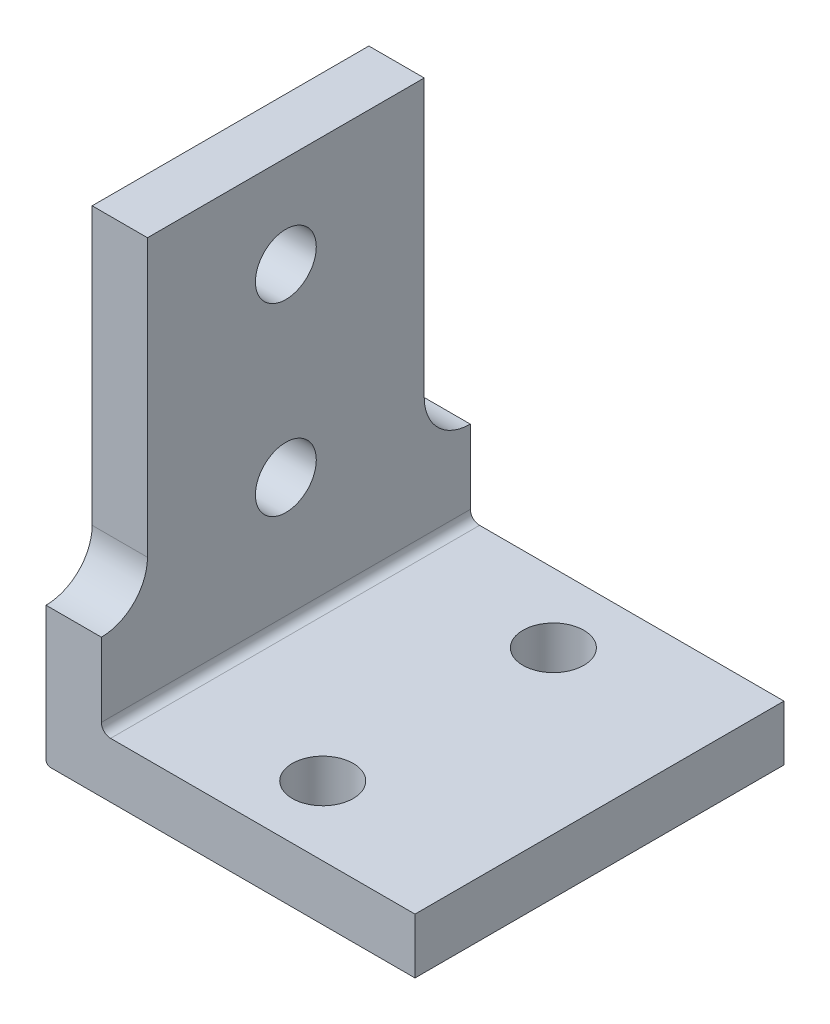
ISO-10303-21;
HEADER;
FILE_DESCRIPTION(('STEP AP214'),'2;1');
FILE_NAME('part.step','',(''),(''),'','','');
FILE_SCHEMA(('AUTOMOTIVE_DESIGN { 1 0 10303 214 1 1 1 1 }'));
ENDSEC;
DATA;
#1=APPLICATION_CONTEXT('core data for automotive mechanical design processes');
#2=APPLICATION_PROTOCOL_DEFINITION('international standard','automotive_design',2000,#1);
#3=PRODUCT_CONTEXT('',#1,'mechanical');
#4=PRODUCT('Part','Part','',(#3));
#5=PRODUCT_RELATED_PRODUCT_CATEGORY('part','',(#4));
#6=PRODUCT_DEFINITION_FORMATION('','',#4);
#7=PRODUCT_DEFINITION_CONTEXT('part definition',#1,'design');
#8=PRODUCT_DEFINITION('design','',#6,#7);
#9=PRODUCT_DEFINITION_SHAPE('','',#8);
#10=(LENGTH_UNIT() NAMED_UNIT(*) SI_UNIT(.MILLI.,.METRE.));
#11=(NAMED_UNIT(*) PLANE_ANGLE_UNIT() SI_UNIT($,.RADIAN.));
#12=(NAMED_UNIT(*) SI_UNIT($,.STERADIAN.) SOLID_ANGLE_UNIT());
#13=UNCERTAINTY_MEASURE_WITH_UNIT(LENGTH_MEASURE(1.E-05),#10,'distance_accuracy_value','');
#14=(GEOMETRIC_REPRESENTATION_CONTEXT(3) GLOBAL_UNCERTAINTY_ASSIGNED_CONTEXT((#13)) GLOBAL_UNIT_ASSIGNED_CONTEXT((#10,
#11,#12)) REPRESENTATION_CONTEXT('',''));
#15=CARTESIAN_POINT('',(0.,0.,0.));
#16=DIRECTION('',(0.,0.,1.));
#17=DIRECTION('',(1.,0.,0.));
#18=AXIS2_PLACEMENT_3D('',#15,#16,#17);
#19=CARTESIAN_POINT('',(0.,50.,40.));
#20=DIRECTION('',(1.,0.,0.));
#21=DIRECTION('',(0.,0.,-1.));
#22=AXIS2_PLACEMENT_3D('',#19,#20,#21);
#23=PLANE('',#22);
#24=CARTESIAN_POINT('',(0.,40.,20.));
#25=DIRECTION('',(1.,0.,0.));
#26=DIRECTION('',(0.,0.,-1.));
#27=AXIS2_PLACEMENT_3D('',#24,#25,#26);
#28=CIRCLE('',#27,3.3);
#29=CARTESIAN_POINT('',(0.,40.,16.7));
#30=VERTEX_POINT('',#29);
#31=EDGE_CURVE('E199',#30,#30,#28,.T.);
#32=ORIENTED_EDGE('',*,*,#31,.T.);
#33=EDGE_LOOP('',(#32));
#34=FACE_BOUND('',#33,.T.);
#35=CARTESIAN_POINT('',(0.,20.,20.));
#36=DIRECTION('',(1.,0.,0.));
#37=DIRECTION('',(0.,0.,-1.));
#38=AXIS2_PLACEMENT_3D('',#35,#36,#37);
#39=CIRCLE('',#38,3.3);
#40=CARTESIAN_POINT('',(0.,20.,16.7));
#41=VERTEX_POINT('',#40);
#42=EDGE_CURVE('E207',#41,#41,#39,.T.);
#43=ORIENTED_EDGE('',*,*,#42,.T.);
#44=EDGE_LOOP('',(#43));
#45=FACE_BOUND('',#44,.T.);
#46=DIRECTION('',(0.,0.,-1.));
#47=VECTOR('',#46,1.);
#48=CARTESIAN_POINT('',(0.,50.,40.));
#49=LINE('',#48,#47);
#50=CARTESIAN_POINT('',(0.,50.,35.));
#51=VERTEX_POINT('',#50);
#52=CARTESIAN_POINT('',(0.,50.,5.));
#53=VERTEX_POINT('',#52);
#54=EDGE_CURVE('E149',#51,#53,#49,.T.);
#55=ORIENTED_EDGE('',*,*,#54,.T.);
#56=DIRECTION('',(0.,-1.,0.));
#57=VECTOR('',#56,1.);
#58=CARTESIAN_POINT('',(0.,20.,5.));
#59=LINE('',#58,#57);
#60=CARTESIAN_POINT('',(0.,20.,5.));
#61=VERTEX_POINT('',#60);
#62=EDGE_CURVE('E132',#53,#61,#59,.T.);
#63=ORIENTED_EDGE('',*,*,#62,.T.);
#64=CARTESIAN_POINT('',(0.,20.,0.));
#65=DIRECTION('',(1.,0.,0.));
#66=DIRECTION('',(0.,-1.,0.));
#67=AXIS2_PLACEMENT_3D('',#64,#65,#66);
#68=CIRCLE('',#67,5.);
#69=CARTESIAN_POINT('',(0.,15.,0.));
#70=VERTEX_POINT('',#69);
#71=EDGE_CURVE('E138',#61,#70,#68,.T.);
#72=ORIENTED_EDGE('',*,*,#71,.T.);
#73=DIRECTION('',(0.,-1.,0.));
#74=VECTOR('',#73,1.);
#75=CARTESIAN_POINT('',(0.,50.,0.));
#76=LINE('',#75,#74);
#77=CARTESIAN_POINT('',(0.,0.5,0.));
#78=VERTEX_POINT('',#77);
#79=EDGE_CURVE('E211',#70,#78,#76,.T.);
#80=ORIENTED_EDGE('',*,*,#79,.T.);
#81=DIRECTION('',(0.,0.,-1.));
#82=VECTOR('',#81,1.);
#83=CARTESIAN_POINT('',(0.,0.5,40.));
#84=LINE('',#83,#82);
#85=CARTESIAN_POINT('',(0.,0.5,40.));
#86=VERTEX_POINT('',#85);
#87=EDGE_CURVE('E49',#78,#86,#84,.F.);
#88=ORIENTED_EDGE('',*,*,#87,.T.);
#89=DIRECTION('',(0.,-1.,0.));
#90=VECTOR('',#89,1.);
#91=CARTESIAN_POINT('',(0.,50.,40.));
#92=LINE('',#91,#90);
#93=CARTESIAN_POINT('',(0.,15.,40.));
#94=VERTEX_POINT('',#93);
#95=EDGE_CURVE('E212',#94,#86,#92,.T.);
#96=ORIENTED_EDGE('',*,*,#95,.F.);
#97=CARTESIAN_POINT('',(0.,20.,40.));
#98=DIRECTION('',(1.,0.,0.));
#99=DIRECTION('',(0.,1.,0.));
#100=AXIS2_PLACEMENT_3D('',#97,#98,#99);
#101=CIRCLE('',#100,5.);
#102=CARTESIAN_POINT('',(0.,20.,35.));
#103=VERTEX_POINT('',#102);
#104=EDGE_CURVE('E56',#94,#103,#101,.T.);
#105=ORIENTED_EDGE('',*,*,#104,.T.);
#106=DIRECTION('',(0.,1.,0.));
#107=VECTOR('',#106,1.);
#108=CARTESIAN_POINT('',(0.,20.,35.));
#109=LINE('',#108,#107);
#110=EDGE_CURVE('E167',#103,#51,#109,.T.);
#111=ORIENTED_EDGE('',*,*,#110,.T.);
#112=EDGE_LOOP('',(#55,#63,#72,#80,#88,#96,#105,#111));
#113=FACE_BOUND('',#112,.T.);
#114=ADVANCED_FACE('F40',(#34,#45,#113),#23,.F.);
#115=CARTESIAN_POINT('',(0.,0.,40.));
#116=DIRECTION('',(0.,1.,0.));
#117=DIRECTION('',(0.,0.,1.));
#118=AXIS2_PLACEMENT_3D('',#115,#116,#117);
#119=PLANE('',#118);
#120=CARTESIAN_POINT('',(22.5,0.,7.5));
#121=DIRECTION('',(0.,-1.,0.));
#122=DIRECTION('',(0.,0.,-1.));
#123=AXIS2_PLACEMENT_3D('',#120,#121,#122);
#124=CIRCLE('',#123,3.29999999999999);
#125=CARTESIAN_POINT('',(22.5,0.,4.20000000000001));
#126=VERTEX_POINT('',#125);
#127=EDGE_CURVE('E162',#126,#126,#124,.T.);
#128=ORIENTED_EDGE('',*,*,#127,.F.);
#129=EDGE_LOOP('',(#128));
#130=FACE_BOUND('',#129,.T.);
#131=CARTESIAN_POINT('',(22.5,0.,32.5));
#132=DIRECTION('',(0.,-1.,0.));
#133=DIRECTION('',(0.,0.,-1.));
#134=AXIS2_PLACEMENT_3D('',#131,#132,#133);
#135=CIRCLE('',#134,3.29999999999999);
#136=CARTESIAN_POINT('',(22.5,0.,29.2));
#137=VERTEX_POINT('',#136);
#138=EDGE_CURVE('E190',#137,#137,#135,.T.);
#139=ORIENTED_EDGE('',*,*,#138,.F.);
#140=EDGE_LOOP('',(#139));
#141=FACE_BOUND('',#140,.T.);
#142=DIRECTION('',(1.,0.,0.));
#143=VECTOR('',#142,1.);
#144=CARTESIAN_POINT('',(0.,0.,40.));
#145=LINE('',#144,#143);
#146=CARTESIAN_POINT('',(0.5,0.,40.));
#147=VERTEX_POINT('',#146);
#148=CARTESIAN_POINT('',(40.,0.,40.));
#149=VERTEX_POINT('',#148);
#150=EDGE_CURVE('E215',#147,#149,#145,.T.);
#151=ORIENTED_EDGE('',*,*,#150,.F.);
#152=DIRECTION('',(0.,0.,-1.));
#153=VECTOR('',#152,1.);
#154=CARTESIAN_POINT('',(0.5,0.,40.));
#155=LINE('',#154,#153);
#156=CARTESIAN_POINT('',(0.5,0.,0.));
#157=VERTEX_POINT('',#156);
#158=EDGE_CURVE('E278',#147,#157,#155,.T.);
#159=ORIENTED_EDGE('',*,*,#158,.T.);
#160=DIRECTION('',(1.,0.,0.));
#161=VECTOR('',#160,1.);
#162=CARTESIAN_POINT('',(0.,0.,0.));
#163=LINE('',#162,#161);
#164=CARTESIAN_POINT('',(40.,0.,0.));
#165=VERTEX_POINT('',#164);
#166=EDGE_CURVE('E232',#157,#165,#163,.T.);
#167=ORIENTED_EDGE('',*,*,#166,.T.);
#168=DIRECTION('',(0.,0.,-1.));
#169=VECTOR('',#168,1.);
#170=CARTESIAN_POINT('',(40.,0.,40.));
#171=LINE('',#170,#169);
#172=EDGE_CURVE('E255',#149,#165,#171,.T.);
#173=ORIENTED_EDGE('',*,*,#172,.F.);
#174=EDGE_LOOP('',(#151,#159,#167,#173));
#175=FACE_BOUND('',#174,.T.);
#176=ADVANCED_FACE('F298',(#130,#141,#175),#119,.F.);
#177=CARTESIAN_POINT('',(40.,0.,40.));
#178=DIRECTION('',(-1.,0.,0.));
#179=DIRECTION('',(0.,0.,1.));
#180=AXIS2_PLACEMENT_3D('',#177,#178,#179);
#181=PLANE('',#180);
#182=DIRECTION('',(0.,1.,0.));
#183=VECTOR('',#182,1.);
#184=CARTESIAN_POINT('',(40.,0.,0.));
#185=LINE('',#184,#183);
#186=CARTESIAN_POINT('',(40.,6.,0.));
#187=VERTEX_POINT('',#186);
#188=EDGE_CURVE('E235',#165,#187,#185,.T.);
#189=ORIENTED_EDGE('',*,*,#188,.T.);
#190=DIRECTION('',(0.,0.,-1.));
#191=VECTOR('',#190,1.);
#192=CARTESIAN_POINT('',(40.,6.,40.));
#193=LINE('',#192,#191);
#194=CARTESIAN_POINT('',(40.,6.,40.));
#195=VERTEX_POINT('',#194);
#196=EDGE_CURVE('E251',#195,#187,#193,.T.);
#197=ORIENTED_EDGE('',*,*,#196,.F.);
#198=DIRECTION('',(0.,1.,0.));
#199=VECTOR('',#198,1.);
#200=CARTESIAN_POINT('',(40.,0.,40.));
#201=LINE('',#200,#199);
#202=EDGE_CURVE('E219',#149,#195,#201,.T.);
#203=ORIENTED_EDGE('',*,*,#202,.F.);
#204=ORIENTED_EDGE('',*,*,#172,.T.);
#205=EDGE_LOOP('',(#189,#197,#203,#204));
#206=FACE_BOUND('',#205,.T.);
#207=ADVANCED_FACE('F304',(#206),#181,.F.);
#208=CARTESIAN_POINT('',(40.,6.,40.));
#209=DIRECTION('',(0.,-1.,0.));
#210=DIRECTION('',(1.,0.,0.));
#211=AXIS2_PLACEMENT_3D('',#208,#209,#210);
#212=PLANE('',#211);
#213=CARTESIAN_POINT('',(22.5,6.,7.5));
#214=DIRECTION('',(0.,-1.,0.));
#215=DIRECTION('',(1.,0.,0.));
#216=AXIS2_PLACEMENT_3D('',#213,#214,#215);
#217=CIRCLE('',#216,3.29999999999999);
#218=CARTESIAN_POINT('',(25.8,6.,7.5));
#219=VERTEX_POINT('',#218);
#220=EDGE_CURVE('E189',#219,#219,#217,.T.);
#221=ORIENTED_EDGE('',*,*,#220,.T.);
#222=EDGE_LOOP('',(#221));
#223=FACE_BOUND('',#222,.T.);
#224=CARTESIAN_POINT('',(22.5,6.,32.5));
#225=DIRECTION('',(0.,-1.,0.));
#226=DIRECTION('',(1.,0.,0.));
#227=AXIS2_PLACEMENT_3D('',#224,#225,#226);
#228=CIRCLE('',#227,3.29999999999999);
#229=CARTESIAN_POINT('',(25.8,6.,32.5));
#230=VERTEX_POINT('',#229);
#231=EDGE_CURVE('E194',#230,#230,#228,.T.);
#232=ORIENTED_EDGE('',*,*,#231,.T.);
#233=EDGE_LOOP('',(#232));
#234=FACE_BOUND('',#233,.T.);
#235=DIRECTION('',(-1.,0.,0.));
#236=VECTOR('',#235,1.);
#237=CARTESIAN_POINT('',(40.,6.,0.));
#238=LINE('',#237,#236);
#239=CARTESIAN_POINT('',(7.,6.,0.));
#240=VERTEX_POINT('',#239);
#241=EDGE_CURVE('E238',#187,#240,#238,.T.);
#242=ORIENTED_EDGE('',*,*,#241,.T.);
#243=DIRECTION('',(0.,0.,-1.));
#244=VECTOR('',#243,1.);
#245=CARTESIAN_POINT('',(7.,6.,40.));
#246=LINE('',#245,#244);
#247=CARTESIAN_POINT('',(7.,6.,40.));
#248=VERTEX_POINT('',#247);
#249=EDGE_CURVE('E269',#240,#248,#246,.F.);
#250=ORIENTED_EDGE('',*,*,#249,.T.);
#251=DIRECTION('',(-1.,0.,0.));
#252=VECTOR('',#251,1.);
#253=CARTESIAN_POINT('',(40.,6.,40.));
#254=LINE('',#253,#252);
#255=EDGE_CURVE('E222',#195,#248,#254,.T.);
#256=ORIENTED_EDGE('',*,*,#255,.F.);
#257=ORIENTED_EDGE('',*,*,#196,.T.);
#258=EDGE_LOOP('',(#242,#250,#256,#257));
#259=FACE_BOUND('',#258,.T.);
#260=ADVANCED_FACE('F320',(#223,#234,#259),#212,.F.);
#261=CARTESIAN_POINT('',(6.,6.,40.));
#262=DIRECTION('',(-1.,0.,0.));
#263=DIRECTION('',(0.,-1.,0.));
#264=AXIS2_PLACEMENT_3D('',#261,#262,#263);
#265=PLANE('',#264);
#266=CARTESIAN_POINT('',(6.,40.,20.));
#267=DIRECTION('',(1.,0.,0.));
#268=DIRECTION('',(0.,0.,-1.));
#269=AXIS2_PLACEMENT_3D('',#266,#267,#268);
#270=CIRCLE('',#269,3.29999999999999);
#271=CARTESIAN_POINT('',(6.,40.,16.7));
#272=VERTEX_POINT('',#271);
#273=EDGE_CURVE('E195',#272,#272,#270,.T.);
#274=ORIENTED_EDGE('',*,*,#273,.F.);
#275=EDGE_LOOP('',(#274));
#276=FACE_BOUND('',#275,.T.);
#277=CARTESIAN_POINT('',(6.,20.,20.));
#278=DIRECTION('',(1.,0.,0.));
#279=DIRECTION('',(0.,0.,-1.));
#280=AXIS2_PLACEMENT_3D('',#277,#278,#279);
#281=CIRCLE('',#280,3.29999999999999);
#282=CARTESIAN_POINT('',(6.,20.,16.7));
#283=VERTEX_POINT('',#282);
#284=EDGE_CURVE('E203',#283,#283,#281,.T.);
#285=ORIENTED_EDGE('',*,*,#284,.F.);
#286=EDGE_LOOP('',(#285));
#287=FACE_BOUND('',#286,.T.);
#288=CARTESIAN_POINT('',(6.,20.,0.));
#289=DIRECTION('',(1.,0.,0.));
#290=DIRECTION('',(0.,-1.,0.));
#291=AXIS2_PLACEMENT_3D('',#288,#289,#290);
#292=CIRCLE('',#291,5.);
#293=CARTESIAN_POINT('',(6.,20.,5.));
#294=VERTEX_POINT('',#293);
#295=CARTESIAN_POINT('',(6.,15.,0.));
#296=VERTEX_POINT('',#295);
#297=EDGE_CURVE('E64',#294,#296,#292,.T.);
#298=ORIENTED_EDGE('',*,*,#297,.F.);
#299=DIRECTION('',(0.,-1.,0.));
#300=VECTOR('',#299,1.);
#301=CARTESIAN_POINT('',(6.,20.,5.));
#302=LINE('',#301,#300);
#303=CARTESIAN_POINT('',(6.,50.,5.));
#304=VERTEX_POINT('',#303);
#305=EDGE_CURVE('E135',#304,#294,#302,.T.);
#306=ORIENTED_EDGE('',*,*,#305,.F.);
#307=DIRECTION('',(0.,0.,-1.));
#308=VECTOR('',#307,1.);
#309=CARTESIAN_POINT('',(6.,50.,40.));
#310=LINE('',#309,#308);
#311=CARTESIAN_POINT('',(6.,50.,35.));
#312=VERTEX_POINT('',#311);
#313=EDGE_CURVE('E247',#312,#304,#310,.T.);
#314=ORIENTED_EDGE('',*,*,#313,.F.);
#315=DIRECTION('',(0.,1.,0.));
#316=VECTOR('',#315,1.);
#317=CARTESIAN_POINT('',(6.,20.,35.));
#318=LINE('',#317,#316);
#319=CARTESIAN_POINT('',(6.,20.,35.));
#320=VERTEX_POINT('',#319);
#321=EDGE_CURVE('E168',#320,#312,#318,.T.);
#322=ORIENTED_EDGE('',*,*,#321,.F.);
#323=CARTESIAN_POINT('',(6.,20.,40.));
#324=DIRECTION('',(1.,0.,0.));
#325=DIRECTION('',(0.,1.,0.));
#326=AXIS2_PLACEMENT_3D('',#323,#324,#325);
#327=CIRCLE('',#326,5.);
#328=CARTESIAN_POINT('',(6.,15.,40.));
#329=VERTEX_POINT('',#328);
#330=EDGE_CURVE('E172',#329,#320,#327,.T.);
#331=ORIENTED_EDGE('',*,*,#330,.F.);
#332=DIRECTION('',(0.,1.,0.));
#333=VECTOR('',#332,1.);
#334=CARTESIAN_POINT('',(6.,6.,40.));
#335=LINE('',#334,#333);
#336=CARTESIAN_POINT('',(6.,7.,40.));
#337=VERTEX_POINT('',#336);
#338=EDGE_CURVE('E226',#337,#329,#335,.T.);
#339=ORIENTED_EDGE('',*,*,#338,.F.);
#340=DIRECTION('',(0.,0.,-1.));
#341=VECTOR('',#340,1.);
#342=CARTESIAN_POINT('',(6.,7.,0.));
#343=LINE('',#342,#341);
#344=CARTESIAN_POINT('',(6.,7.,0.));
#345=VERTEX_POINT('',#344);
#346=EDGE_CURVE('E259',#337,#345,#343,.T.);
#347=ORIENTED_EDGE('',*,*,#346,.T.);
#348=DIRECTION('',(0.,1.,0.));
#349=VECTOR('',#348,1.);
#350=CARTESIAN_POINT('',(6.,6.,0.));
#351=LINE('',#350,#349);
#352=EDGE_CURVE('E216',#345,#296,#351,.T.);
#353=ORIENTED_EDGE('',*,*,#352,.T.);
#354=EDGE_LOOP('',(#298,#306,#314,#322,#331,#339,#347,#353));
#355=FACE_BOUND('',#354,.T.);
#356=ADVANCED_FACE('F315',(#276,#287,#355),#265,.F.);
#357=CARTESIAN_POINT('',(6.,50.,40.));
#358=DIRECTION('',(0.,-1.,0.));
#359=DIRECTION('',(0.,0.,-1.));
#360=AXIS2_PLACEMENT_3D('',#357,#358,#359);
#361=PLANE('',#360);
#362=ORIENTED_EDGE('',*,*,#313,.T.);
#363=DIRECTION('',(1.,0.,0.));
#364=VECTOR('',#363,1.);
#365=CARTESIAN_POINT('',(0.,50.,5.));
#366=LINE('',#365,#364);
#367=EDGE_CURVE('E159',#53,#304,#366,.T.);
#368=ORIENTED_EDGE('',*,*,#367,.F.);
#369=ORIENTED_EDGE('',*,*,#54,.F.);
#370=DIRECTION('',(1.,0.,0.));
#371=VECTOR('',#370,1.);
#372=CARTESIAN_POINT('',(0.,50.,35.));
#373=LINE('',#372,#371);
#374=EDGE_CURVE('E157',#51,#312,#373,.T.);
#375=ORIENTED_EDGE('',*,*,#374,.T.);
#376=EDGE_LOOP('',(#362,#368,#369,#375));
#377=FACE_BOUND('',#376,.T.);
#378=ADVANCED_FACE('F328',(#377),#361,.F.);
#379=CARTESIAN_POINT('',(0.,0.,40.));
#380=DIRECTION('',(0.,0.,1.));
#381=DIRECTION('',(1.,0.,0.));
#382=AXIS2_PLACEMENT_3D('',#379,#380,#381);
#383=PLANE('',#382);
#384=DIRECTION('',(1.,0.,0.));
#385=VECTOR('',#384,1.);
#386=CARTESIAN_POINT('',(0.,15.,40.));
#387=LINE('',#386,#385);
#388=EDGE_CURVE('E171',#94,#329,#387,.T.);
#389=ORIENTED_EDGE('',*,*,#388,.F.);
#390=ORIENTED_EDGE('',*,*,#95,.T.);
#391=CARTESIAN_POINT('',(0.5,0.5,40.));
#392=DIRECTION('',(0.,0.,1.));
#393=DIRECTION('',(1.,0.,0.));
#394=AXIS2_PLACEMENT_3D('',#391,#392,#393);
#395=CIRCLE('',#394,0.5);
#396=EDGE_CURVE('E11',#86,#147,#395,.T.);
#397=ORIENTED_EDGE('',*,*,#396,.T.);
#398=ORIENTED_EDGE('',*,*,#150,.T.);
#399=ORIENTED_EDGE('',*,*,#202,.T.);
#400=ORIENTED_EDGE('',*,*,#255,.T.);
#401=CARTESIAN_POINT('',(7.,7.,40.));
#402=DIRECTION('',(0.,0.,1.));
#403=DIRECTION('',(1.,0.,0.));
#404=AXIS2_PLACEMENT_3D('',#401,#402,#403);
#405=CIRCLE('',#404,1.);
#406=EDGE_CURVE('E275',#248,#337,#405,.F.);
#407=ORIENTED_EDGE('',*,*,#406,.T.);
#408=ORIENTED_EDGE('',*,*,#338,.T.);
#409=EDGE_LOOP('',(#389,#390,#397,#398,#399,#400,#407,#408));
#410=FACE_BOUND('',#409,.T.);
#411=ADVANCED_FACE('F295',(#410),#383,.T.);
#412=CARTESIAN_POINT('',(0.,0.,0.));
#413=DIRECTION('',(0.,0.,1.));
#414=DIRECTION('',(1.,0.,0.));
#415=AXIS2_PLACEMENT_3D('',#412,#413,#414);
#416=PLANE('',#415);
#417=ORIENTED_EDGE('',*,*,#79,.F.);
#418=DIRECTION('',(1.,0.,0.));
#419=VECTOR('',#418,1.);
#420=CARTESIAN_POINT('',(0.,15.,0.));
#421=LINE('',#420,#419);
#422=EDGE_CURVE('E137',#70,#296,#421,.T.);
#423=ORIENTED_EDGE('',*,*,#422,.T.);
#424=ORIENTED_EDGE('',*,*,#352,.F.);
#425=CARTESIAN_POINT('',(7.,7.,0.));
#426=DIRECTION('',(0.,0.,1.));
#427=DIRECTION('',(1.,0.,0.));
#428=AXIS2_PLACEMENT_3D('',#425,#426,#427);
#429=CIRCLE('',#428,1.);
#430=EDGE_CURVE('E272',#345,#240,#429,.T.);
#431=ORIENTED_EDGE('',*,*,#430,.T.);
#432=ORIENTED_EDGE('',*,*,#241,.F.);
#433=ORIENTED_EDGE('',*,*,#188,.F.);
#434=ORIENTED_EDGE('',*,*,#166,.F.);
#435=CARTESIAN_POINT('',(0.5,0.5,0.));
#436=DIRECTION('',(0.,0.,1.));
#437=DIRECTION('',(1.,0.,0.));
#438=AXIS2_PLACEMENT_3D('',#435,#436,#437);
#439=CIRCLE('',#438,0.5);
#440=EDGE_CURVE('E282',#157,#78,#439,.F.);
#441=ORIENTED_EDGE('',*,*,#440,.T.);
#442=EDGE_LOOP('',(#417,#423,#424,#431,#432,#433,#434,#441));
#443=FACE_BOUND('',#442,.T.);
#444=ADVANCED_FACE('F318',(#443),#416,.F.);
#445=CARTESIAN_POINT('',(6.,20.,20.));
#446=DIRECTION('',(1.,0.,0.));
#447=DIRECTION('',(0.,0.,-1.));
#448=AXIS2_PLACEMENT_3D('',#445,#446,#447);
#449=CYLINDRICAL_SURFACE('',#448,3.29999999999999);
#450=ORIENTED_EDGE('',*,*,#42,.F.);
#451=EDGE_LOOP('',(#450));
#452=FACE_BOUND('',#451,.T.);
#453=ORIENTED_EDGE('',*,*,#284,.T.);
#454=EDGE_LOOP('',(#453));
#455=FACE_BOUND('',#454,.T.);
#456=ADVANCED_FACE('F364',(#452,#455),#449,.F.);
#457=CARTESIAN_POINT('',(6.,40.,20.));
#458=DIRECTION('',(1.,0.,0.));
#459=DIRECTION('',(0.,0.,-1.));
#460=AXIS2_PLACEMENT_3D('',#457,#458,#459);
#461=CYLINDRICAL_SURFACE('',#460,3.29999999999999);
#462=ORIENTED_EDGE('',*,*,#31,.F.);
#463=EDGE_LOOP('',(#462));
#464=FACE_BOUND('',#463,.T.);
#465=ORIENTED_EDGE('',*,*,#273,.T.);
#466=EDGE_LOOP('',(#465));
#467=FACE_BOUND('',#466,.T.);
#468=ADVANCED_FACE('F354',(#464,#467),#461,.F.);
#469=CARTESIAN_POINT('',(22.5,0.,32.5));
#470=DIRECTION('',(0.,-1.,0.));
#471=DIRECTION('',(0.,0.,-1.));
#472=AXIS2_PLACEMENT_3D('',#469,#470,#471);
#473=CYLINDRICAL_SURFACE('',#472,3.29999999999999);
#474=ORIENTED_EDGE('',*,*,#138,.T.);
#475=EDGE_LOOP('',(#474));
#476=FACE_BOUND('',#475,.T.);
#477=ORIENTED_EDGE('',*,*,#231,.F.);
#478=EDGE_LOOP('',(#477));
#479=FACE_BOUND('',#478,.T.);
#480=ADVANCED_FACE('F348',(#476,#479),#473,.F.);
#481=CARTESIAN_POINT('',(22.5,0.,7.5));
#482=DIRECTION('',(0.,-1.,0.));
#483=DIRECTION('',(0.,0.,-1.));
#484=AXIS2_PLACEMENT_3D('',#481,#482,#483);
#485=CYLINDRICAL_SURFACE('',#484,3.29999999999999);
#486=ORIENTED_EDGE('',*,*,#127,.T.);
#487=EDGE_LOOP('',(#486));
#488=FACE_BOUND('',#487,.T.);
#489=ORIENTED_EDGE('',*,*,#220,.F.);
#490=EDGE_LOOP('',(#489));
#491=FACE_BOUND('',#490,.T.);
#492=ADVANCED_FACE('F343',(#488,#491),#485,.F.);
#493=CARTESIAN_POINT('',(7.,7.,40.));
#494=DIRECTION('',(0.,0.,1.));
#495=DIRECTION('',(1.,0.,0.));
#496=AXIS2_PLACEMENT_3D('',#493,#494,#495);
#497=CYLINDRICAL_SURFACE('',#496,1.);
#498=ORIENTED_EDGE('',*,*,#406,.F.);
#499=ORIENTED_EDGE('',*,*,#249,.F.);
#500=ORIENTED_EDGE('',*,*,#430,.F.);
#501=ORIENTED_EDGE('',*,*,#346,.F.);
#502=EDGE_LOOP('',(#498,#499,#500,#501));
#503=FACE_BOUND('',#502,.T.);
#504=ADVANCED_FACE('F312',(#503),#497,.F.);
#505=CARTESIAN_POINT('',(0.5,0.5,40.));
#506=DIRECTION('',(0.,0.,-1.));
#507=DIRECTION('',(-1.,0.,0.));
#508=AXIS2_PLACEMENT_3D('',#505,#506,#507);
#509=CYLINDRICAL_SURFACE('',#508,0.5);
#510=ORIENTED_EDGE('',*,*,#396,.F.);
#511=ORIENTED_EDGE('',*,*,#87,.F.);
#512=ORIENTED_EDGE('',*,*,#440,.F.);
#513=ORIENTED_EDGE('',*,*,#158,.F.);
#514=EDGE_LOOP('',(#510,#511,#512,#513));
#515=FACE_BOUND('',#514,.T.);
#516=ADVANCED_FACE('F42',(#515),#509,.T.);
#517=CARTESIAN_POINT('',(0.,20.,5.));
#518=DIRECTION('',(0.,0.,1.));
#519=DIRECTION('',(1.,0.,0.));
#520=AXIS2_PLACEMENT_3D('',#517,#518,#519);
#521=PLANE('',#520);
#522=ORIENTED_EDGE('',*,*,#305,.T.);
#523=DIRECTION('',(1.,0.,0.));
#524=VECTOR('',#523,1.);
#525=CARTESIAN_POINT('',(0.,20.,5.));
#526=LINE('',#525,#524);
#527=EDGE_CURVE('E128',#61,#294,#526,.T.);
#528=ORIENTED_EDGE('',*,*,#527,.F.);
#529=ORIENTED_EDGE('',*,*,#62,.F.);
#530=ORIENTED_EDGE('',*,*,#367,.T.);
#531=EDGE_LOOP('',(#522,#528,#529,#530));
#532=FACE_BOUND('',#531,.T.);
#533=ADVANCED_FACE('F130',(#532),#521,.F.);
#534=CARTESIAN_POINT('',(0.,20.,0.));
#535=DIRECTION('',(1.,0.,0.));
#536=DIRECTION('',(0.,1.,0.));
#537=AXIS2_PLACEMENT_3D('',#534,#535,#536);
#538=CYLINDRICAL_SURFACE('',#537,5.);
#539=ORIENTED_EDGE('',*,*,#297,.T.);
#540=ORIENTED_EDGE('',*,*,#422,.F.);
#541=ORIENTED_EDGE('',*,*,#71,.F.);
#542=ORIENTED_EDGE('',*,*,#527,.T.);
#543=EDGE_LOOP('',(#539,#540,#541,#542));
#544=FACE_BOUND('',#543,.T.);
#545=ADVANCED_FACE('F141',(#544),#538,.F.);
#546=CARTESIAN_POINT('',(0.,20.,35.));
#547=DIRECTION('',(0.,0.,-1.));
#548=DIRECTION('',(-1.,0.,0.));
#549=AXIS2_PLACEMENT_3D('',#546,#547,#548);
#550=PLANE('',#549);
#551=ORIENTED_EDGE('',*,*,#321,.T.);
#552=ORIENTED_EDGE('',*,*,#374,.F.);
#553=ORIENTED_EDGE('',*,*,#110,.F.);
#554=DIRECTION('',(1.,0.,0.));
#555=VECTOR('',#554,1.);
#556=CARTESIAN_POINT('',(0.,20.,35.));
#557=LINE('',#556,#555);
#558=EDGE_CURVE('E181',#103,#320,#557,.T.);
#559=ORIENTED_EDGE('',*,*,#558,.T.);
#560=EDGE_LOOP('',(#551,#552,#553,#559));
#561=FACE_BOUND('',#560,.T.);
#562=ADVANCED_FACE('F380',(#561),#550,.F.);
#563=CARTESIAN_POINT('',(0.,20.,40.));
#564=DIRECTION('',(1.,0.,0.));
#565=DIRECTION('',(0.,1.,0.));
#566=AXIS2_PLACEMENT_3D('',#563,#564,#565);
#567=CYLINDRICAL_SURFACE('',#566,5.);
#568=ORIENTED_EDGE('',*,*,#330,.T.);
#569=ORIENTED_EDGE('',*,*,#558,.F.);
#570=ORIENTED_EDGE('',*,*,#104,.F.);
#571=ORIENTED_EDGE('',*,*,#388,.T.);
#572=EDGE_LOOP('',(#568,#569,#570,#571));
#573=FACE_BOUND('',#572,.T.);
#574=ADVANCED_FACE('F359',(#573),#567,.F.);
#575=CLOSED_SHELL('',(#114,#176,#207,#260,#356,#378,#411,#444,#456,#468,#480,#492,#504,#516,
#533,#545,#562,#574));
#576=MANIFOLD_SOLID_BREP('B2',#575);
#577=ADVANCED_BREP_SHAPE_REPRESENTATION('',(#18,#576),#14);
#578=SHAPE_DEFINITION_REPRESENTATION(#9,#577);
ENDSEC;
END-ISO-10303-21;
